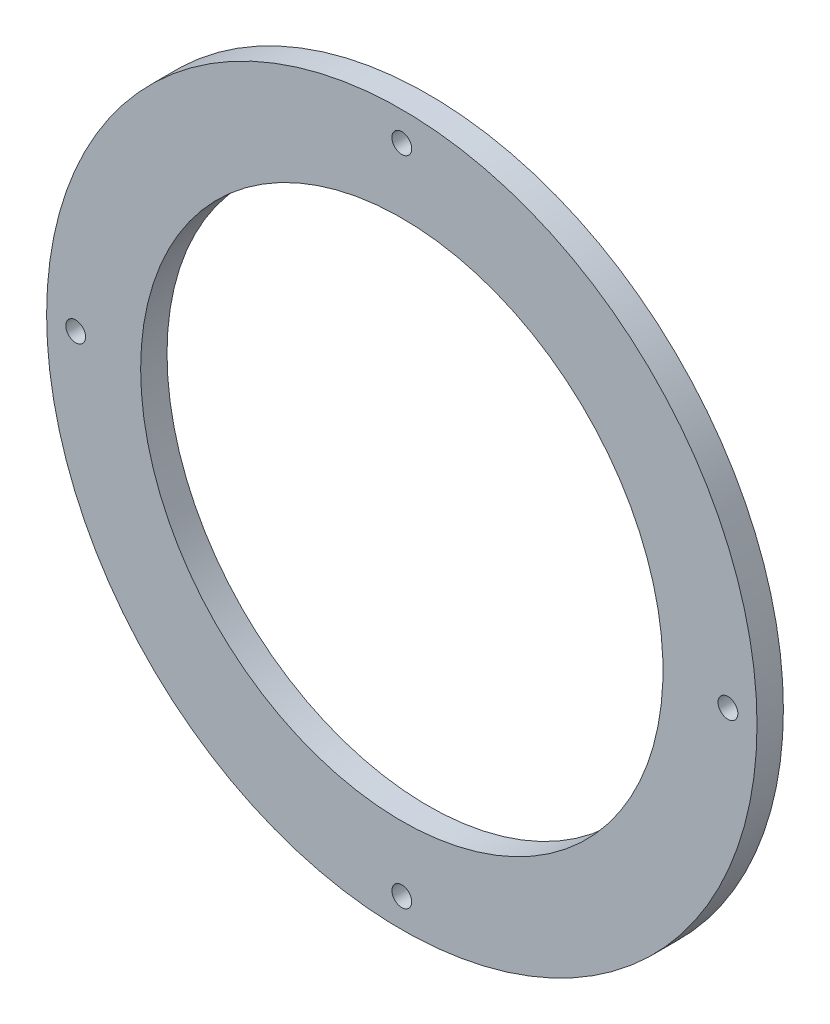
ISO-10303-21;
HEADER;
FILE_DESCRIPTION(('STEP AP214'),'2;1');
FILE_NAME('part.step','',(''),(''),'','','');
FILE_SCHEMA(('AUTOMOTIVE_DESIGN { 1 0 10303 214 1 1 1 1 }'));
ENDSEC;
DATA;
#1=APPLICATION_CONTEXT('core data for automotive mechanical design processes');
#2=APPLICATION_PROTOCOL_DEFINITION('international standard','automotive_design',2000,#1);
#3=PRODUCT_CONTEXT('',#1,'mechanical');
#4=PRODUCT('Part','Part','',(#3));
#5=PRODUCT_RELATED_PRODUCT_CATEGORY('part','',(#4));
#6=PRODUCT_DEFINITION_FORMATION('','',#4);
#7=PRODUCT_DEFINITION_CONTEXT('part definition',#1,'design');
#8=PRODUCT_DEFINITION('design','',#6,#7);
#9=PRODUCT_DEFINITION_SHAPE('','',#8);
#10=(LENGTH_UNIT() NAMED_UNIT(*) SI_UNIT(.MILLI.,.METRE.));
#11=(NAMED_UNIT(*) PLANE_ANGLE_UNIT() SI_UNIT($,.RADIAN.));
#12=(NAMED_UNIT(*) SI_UNIT($,.STERADIAN.) SOLID_ANGLE_UNIT());
#13=UNCERTAINTY_MEASURE_WITH_UNIT(LENGTH_MEASURE(1.E-05),#10,'distance_accuracy_value','');
#14=(GEOMETRIC_REPRESENTATION_CONTEXT(3) GLOBAL_UNCERTAINTY_ASSIGNED_CONTEXT((#13)) GLOBAL_UNIT_ASSIGNED_CONTEXT((#10,
#11,#12)) REPRESENTATION_CONTEXT('',''));
#15=CARTESIAN_POINT('',(0.,0.,0.));
#16=DIRECTION('',(0.,0.,1.));
#17=DIRECTION('',(1.,0.,0.));
#18=AXIS2_PLACEMENT_3D('',#15,#16,#17);
#19=CARTESIAN_POINT('',(0.,0.,6.35));
#20=DIRECTION('',(0.,0.,1.));
#21=DIRECTION('',(1.,0.,0.));
#22=AXIS2_PLACEMENT_3D('',#19,#20,#21);
#23=PLANE('',#22);
#24=CARTESIAN_POINT('',(0.,0.,6.35));
#25=DIRECTION('',(0.,0.,-1.));
#26=DIRECTION('',(-1.,0.,0.));
#27=AXIS2_PLACEMENT_3D('',#24,#25,#26);
#28=CIRCLE('',#27,62.865);
#29=CARTESIAN_POINT('',(-62.865,0.,6.35));
#30=VERTEX_POINT('',#29);
#31=EDGE_CURVE('E92',#30,#30,#28,.T.);
#32=ORIENTED_EDGE('',*,*,#31,.T.);
#33=EDGE_LOOP('',(#32));
#34=FACE_BOUND('',#33,.T.);
#35=CARTESIAN_POINT('',(2.80000286194751E-08,-78.5,6.35));
#36=DIRECTION('',(0.,0.,1.));
#37=DIRECTION('',(1.,0.,0.));
#38=AXIS2_PLACEMENT_3D('',#35,#36,#37);
#39=CIRCLE('',#38,2.38125000000005);
#40=CARTESIAN_POINT('',(2.38125002800008,-78.5,6.35));
#41=VERTEX_POINT('',#40);
#42=EDGE_CURVE('E80',#41,#41,#39,.T.);
#43=ORIENTED_EDGE('',*,*,#42,.F.);
#44=EDGE_LOOP('',(#43));
#45=FACE_BOUND('',#44,.T.);
#46=CARTESIAN_POINT('',(2.34568847912113E-13,78.499999972,6.35));
#47=DIRECTION('',(0.,0.,1.));
#48=DIRECTION('',(1.,0.,0.));
#49=AXIS2_PLACEMENT_3D('',#46,#47,#48);
#50=CIRCLE('',#49,2.38125000000001);
#51=CARTESIAN_POINT('',(2.38125000000024,78.499999972,6.35));
#52=VERTEX_POINT('',#51);
#53=EDGE_CURVE('E69',#52,#52,#50,.T.);
#54=ORIENTED_EDGE('',*,*,#53,.F.);
#55=EDGE_LOOP('',(#54));
#56=FACE_BOUND('',#55,.T.);
#57=CARTESIAN_POINT('',(0.,0.,6.35));
#58=DIRECTION('',(0.,0.,1.));
#59=DIRECTION('',(1.,0.,0.));
#60=AXIS2_PLACEMENT_3D('',#57,#58,#59);
#61=CIRCLE('',#60,85.5);
#62=CARTESIAN_POINT('',(85.5,0.,6.35));
#63=VERTEX_POINT('',#62);
#64=EDGE_CURVE('E11',#63,#63,#61,.T.);
#65=ORIENTED_EDGE('',*,*,#64,.T.);
#66=EDGE_LOOP('',(#65));
#67=FACE_BOUND('',#66,.T.);
#68=CARTESIAN_POINT('',(78.5,0.,6.35));
#69=DIRECTION('',(0.,0.,1.));
#70=DIRECTION('',(1.,0.,0.));
#71=AXIS2_PLACEMENT_3D('',#68,#69,#70);
#72=CIRCLE('',#71,2.38125000000001);
#73=CARTESIAN_POINT('',(80.88125,0.,6.35));
#74=VERTEX_POINT('',#73);
#75=EDGE_CURVE('E74',#74,#74,#72,.T.);
#76=ORIENTED_EDGE('',*,*,#75,.F.);
#77=EDGE_LOOP('',(#76));
#78=FACE_BOUND('',#77,.T.);
#79=CARTESIAN_POINT('',(-78.499999972,-2.80000326310231E-08,6.35));
#80=DIRECTION('',(0.,0.,1.));
#81=DIRECTION('',(1.,0.,0.));
#82=AXIS2_PLACEMENT_3D('',#79,#80,#81);
#83=CIRCLE('',#82,2.38125000000006);
#84=CARTESIAN_POINT('',(-76.1187499719999,-2.80000326310231E-08,6.35));
#85=VERTEX_POINT('',#84);
#86=EDGE_CURVE('E86',#85,#85,#83,.T.);
#87=ORIENTED_EDGE('',*,*,#86,.F.);
#88=EDGE_LOOP('',(#87));
#89=FACE_BOUND('',#88,.T.);
#90=ADVANCED_FACE('F58',(#34,#45,#56,#67,#78,#89),#23,.T.);
#91=CARTESIAN_POINT('',(0.,0.,0.));
#92=DIRECTION('',(0.,0.,1.));
#93=DIRECTION('',(1.,0.,0.));
#94=AXIS2_PLACEMENT_3D('',#91,#92,#93);
#95=PLANE('',#94);
#96=CARTESIAN_POINT('',(0.,0.,0.));
#97=DIRECTION('',(0.,0.,-1.));
#98=DIRECTION('',(-1.,0.,0.));
#99=AXIS2_PLACEMENT_3D('',#96,#97,#98);
#100=CIRCLE('',#99,62.865);
#101=CARTESIAN_POINT('',(-62.865,0.,0.));
#102=VERTEX_POINT('',#101);
#103=EDGE_CURVE('E95',#102,#102,#100,.T.);
#104=ORIENTED_EDGE('',*,*,#103,.F.);
#105=EDGE_LOOP('',(#104));
#106=FACE_BOUND('',#105,.T.);
#107=CARTESIAN_POINT('',(0.,0.,0.));
#108=DIRECTION('',(0.,0.,1.));
#109=DIRECTION('',(1.,0.,0.));
#110=AXIS2_PLACEMENT_3D('',#107,#108,#109);
#111=CIRCLE('',#110,85.5);
#112=CARTESIAN_POINT('',(85.5,0.,0.));
#113=VERTEX_POINT('',#112);
#114=EDGE_CURVE('E62',#113,#113,#111,.T.);
#115=ORIENTED_EDGE('',*,*,#114,.F.);
#116=EDGE_LOOP('',(#115));
#117=FACE_BOUND('',#116,.T.);
#118=CARTESIAN_POINT('',(2.34568847912113E-13,78.499999972,0.));
#119=DIRECTION('',(0.,0.,1.));
#120=DIRECTION('',(1.,0.,0.));
#121=AXIS2_PLACEMENT_3D('',#118,#119,#120);
#122=CIRCLE('',#121,2.38125000000001);
#123=CARTESIAN_POINT('',(2.38125000000024,78.499999972,0.));
#124=VERTEX_POINT('',#123);
#125=EDGE_CURVE('E71',#124,#124,#122,.T.);
#126=ORIENTED_EDGE('',*,*,#125,.T.);
#127=EDGE_LOOP('',(#126));
#128=FACE_BOUND('',#127,.T.);
#129=CARTESIAN_POINT('',(78.5,0.,0.));
#130=DIRECTION('',(0.,0.,1.));
#131=DIRECTION('',(1.,0.,0.));
#132=AXIS2_PLACEMENT_3D('',#129,#130,#131);
#133=CIRCLE('',#132,2.38125000000001);
#134=CARTESIAN_POINT('',(80.88125,0.,0.));
#135=VERTEX_POINT('',#134);
#136=EDGE_CURVE('E77',#135,#135,#133,.T.);
#137=ORIENTED_EDGE('',*,*,#136,.T.);
#138=EDGE_LOOP('',(#137));
#139=FACE_BOUND('',#138,.T.);
#140=CARTESIAN_POINT('',(2.80000286194751E-08,-78.5,0.));
#141=DIRECTION('',(0.,0.,1.));
#142=DIRECTION('',(1.,0.,0.));
#143=AXIS2_PLACEMENT_3D('',#140,#141,#142);
#144=CIRCLE('',#143,2.38125000000005);
#145=CARTESIAN_POINT('',(2.38125002800008,-78.5,0.));
#146=VERTEX_POINT('',#145);
#147=EDGE_CURVE('E83',#146,#146,#144,.T.);
#148=ORIENTED_EDGE('',*,*,#147,.T.);
#149=EDGE_LOOP('',(#148));
#150=FACE_BOUND('',#149,.T.);
#151=CARTESIAN_POINT('',(-78.499999972,-2.80000326310231E-08,0.));
#152=DIRECTION('',(0.,0.,1.));
#153=DIRECTION('',(1.,0.,0.));
#154=AXIS2_PLACEMENT_3D('',#151,#152,#153);
#155=CIRCLE('',#154,2.38125000000006);
#156=CARTESIAN_POINT('',(-76.1187499719999,-2.80000326310231E-08,0.));
#157=VERTEX_POINT('',#156);
#158=EDGE_CURVE('E89',#157,#157,#155,.T.);
#159=ORIENTED_EDGE('',*,*,#158,.T.);
#160=EDGE_LOOP('',(#159));
#161=FACE_BOUND('',#160,.T.);
#162=ADVANCED_FACE('F110',(#106,#117,#128,#139,#150,#161),#95,.F.);
#163=CARTESIAN_POINT('',(0.,0.,6.35));
#164=DIRECTION('',(0.,0.,-1.));
#165=DIRECTION('',(-1.,0.,0.));
#166=AXIS2_PLACEMENT_3D('',#163,#164,#165);
#167=CYLINDRICAL_SURFACE('',#166,85.5);
#168=ORIENTED_EDGE('',*,*,#64,.F.);
#169=EDGE_LOOP('',(#168));
#170=FACE_BOUND('',#169,.T.);
#171=ORIENTED_EDGE('',*,*,#114,.T.);
#172=EDGE_LOOP('',(#171));
#173=FACE_BOUND('',#172,.T.);
#174=ADVANCED_FACE('F60',(#170,#173),#167,.T.);
#175=CARTESIAN_POINT('',(2.34568847912113E-13,78.499999972,6.35));
#176=DIRECTION('',(0.,0.,-1.));
#177=DIRECTION('',(-1.,0.,0.));
#178=AXIS2_PLACEMENT_3D('',#175,#176,#177);
#179=CYLINDRICAL_SURFACE('',#178,2.38125000000001);
#180=ORIENTED_EDGE('',*,*,#53,.T.);
#181=EDGE_LOOP('',(#180));
#182=FACE_BOUND('',#181,.T.);
#183=ORIENTED_EDGE('',*,*,#125,.F.);
#184=EDGE_LOOP('',(#183));
#185=FACE_BOUND('',#184,.T.);
#186=ADVANCED_FACE('F138',(#182,#185),#179,.F.);
#187=CARTESIAN_POINT('',(78.5,0.,6.35));
#188=DIRECTION('',(0.,0.,-1.));
#189=DIRECTION('',(-1.,0.,0.));
#190=AXIS2_PLACEMENT_3D('',#187,#188,#189);
#191=CYLINDRICAL_SURFACE('',#190,2.38125000000001);
#192=ORIENTED_EDGE('',*,*,#75,.T.);
#193=EDGE_LOOP('',(#192));
#194=FACE_BOUND('',#193,.T.);
#195=ORIENTED_EDGE('',*,*,#136,.F.);
#196=EDGE_LOOP('',(#195));
#197=FACE_BOUND('',#196,.T.);
#198=ADVANCED_FACE('F130',(#194,#197),#191,.F.);
#199=CARTESIAN_POINT('',(2.80000286194751E-08,-78.5,6.35));
#200=DIRECTION('',(0.,0.,-1.));
#201=DIRECTION('',(-1.,0.,0.));
#202=AXIS2_PLACEMENT_3D('',#199,#200,#201);
#203=CYLINDRICAL_SURFACE('',#202,2.38125000000005);
#204=ORIENTED_EDGE('',*,*,#42,.T.);
#205=EDGE_LOOP('',(#204));
#206=FACE_BOUND('',#205,.T.);
#207=ORIENTED_EDGE('',*,*,#147,.F.);
#208=EDGE_LOOP('',(#207));
#209=FACE_BOUND('',#208,.T.);
#210=ADVANCED_FACE('F124',(#206,#209),#203,.F.);
#211=CARTESIAN_POINT('',(-78.499999972,-2.80000326310231E-08,6.35));
#212=DIRECTION('',(0.,0.,-1.));
#213=DIRECTION('',(-1.,0.,0.));
#214=AXIS2_PLACEMENT_3D('',#211,#212,#213);
#215=CYLINDRICAL_SURFACE('',#214,2.38125000000006);
#216=ORIENTED_EDGE('',*,*,#86,.T.);
#217=EDGE_LOOP('',(#216));
#218=FACE_BOUND('',#217,.T.);
#219=ORIENTED_EDGE('',*,*,#158,.F.);
#220=EDGE_LOOP('',(#219));
#221=FACE_BOUND('',#220,.T.);
#222=ADVANCED_FACE('F106',(#218,#221),#215,.F.);
#223=CARTESIAN_POINT('',(0.,0.,6.35));
#224=DIRECTION('',(0.,0.,-1.));
#225=DIRECTION('',(-1.,0.,0.));
#226=AXIS2_PLACEMENT_3D('',#223,#224,#225);
#227=CYLINDRICAL_SURFACE('',#226,62.865);
#228=ORIENTED_EDGE('',*,*,#31,.F.);
#229=EDGE_LOOP('',(#228));
#230=FACE_BOUND('',#229,.T.);
#231=ORIENTED_EDGE('',*,*,#103,.T.);
#232=EDGE_LOOP('',(#231));
#233=FACE_BOUND('',#232,.T.);
#234=ADVANCED_FACE('F103',(#230,#233),#227,.F.);
#235=CLOSED_SHELL('',(#90,#162,#174,#186,#198,#210,#222,#234));
#236=MANIFOLD_SOLID_BREP('B2',#235);
#237=ADVANCED_BREP_SHAPE_REPRESENTATION('',(#18,#236),#14);
#238=SHAPE_DEFINITION_REPRESENTATION(#9,#237);
ENDSEC;
END-ISO-10303-21;
